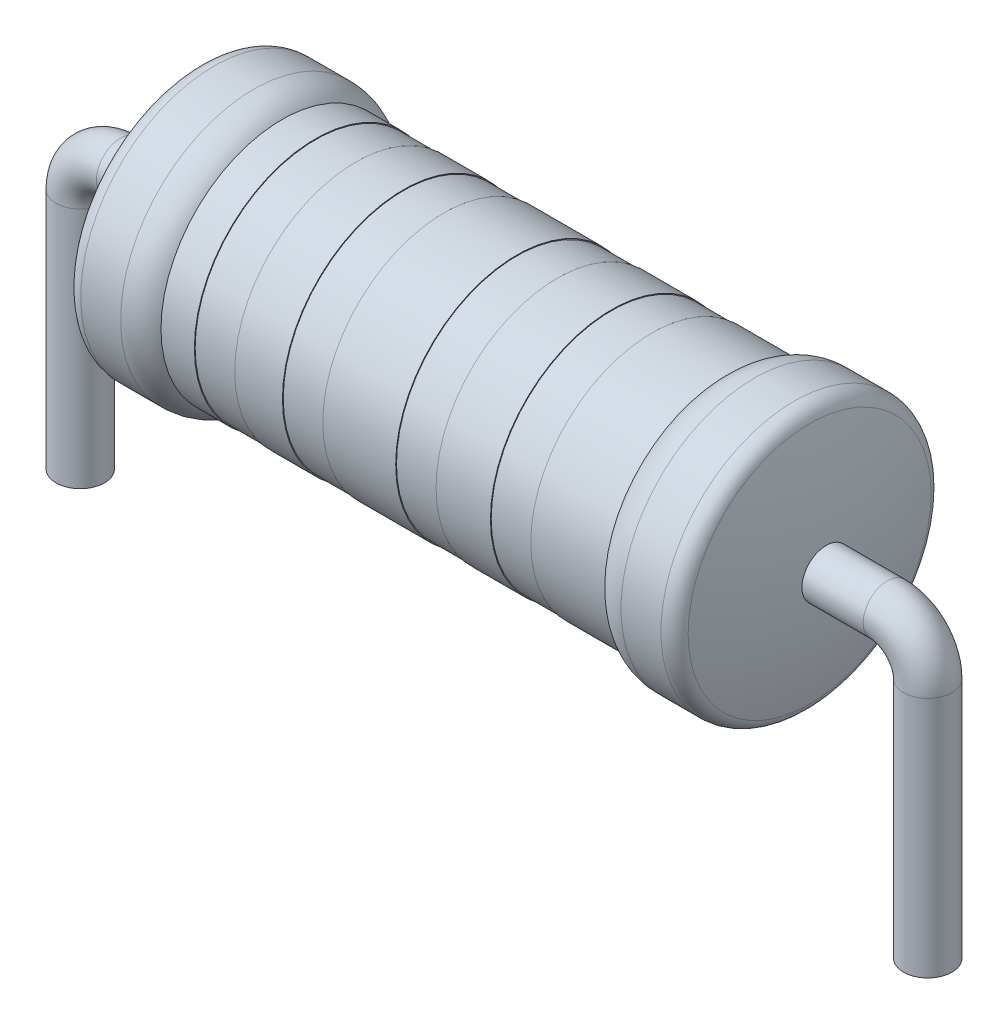
ISO-10303-21;
HEADER;
FILE_DESCRIPTION(('STEP AP214'),'2;1');
FILE_NAME('part.step','',(''),(''),'','','');
FILE_SCHEMA(('AUTOMOTIVE_DESIGN { 1 0 10303 214 1 1 1 1 }'));
ENDSEC;
DATA;
#1=APPLICATION_CONTEXT('core data for automotive mechanical design processes');
#2=APPLICATION_PROTOCOL_DEFINITION('international standard','automotive_design',2000,#1);
#3=PRODUCT_CONTEXT('',#1,'mechanical');
#4=PRODUCT('Part','Part','',(#3));
#5=PRODUCT_RELATED_PRODUCT_CATEGORY('part','',(#4));
#6=PRODUCT_DEFINITION_FORMATION('','',#4);
#7=PRODUCT_DEFINITION_CONTEXT('part definition',#1,'design');
#8=PRODUCT_DEFINITION('design','',#6,#7);
#9=PRODUCT_DEFINITION_SHAPE('','',#8);
#10=(LENGTH_UNIT() NAMED_UNIT(*) SI_UNIT(.MILLI.,.METRE.));
#11=(NAMED_UNIT(*) PLANE_ANGLE_UNIT() SI_UNIT($,.RADIAN.));
#12=(NAMED_UNIT(*) SI_UNIT($,.STERADIAN.) SOLID_ANGLE_UNIT());
#13=UNCERTAINTY_MEASURE_WITH_UNIT(LENGTH_MEASURE(1.E-05),#10,'distance_accuracy_value','');
#14=(GEOMETRIC_REPRESENTATION_CONTEXT(3) GLOBAL_UNCERTAINTY_ASSIGNED_CONTEXT((#13)) GLOBAL_UNIT_ASSIGNED_CONTEXT((#10,
#11,#12)) REPRESENTATION_CONTEXT('',''));
#15=CARTESIAN_POINT('',(0.,0.,0.));
#16=DIRECTION('',(0.,0.,1.));
#17=DIRECTION('',(1.,0.,0.));
#18=AXIS2_PLACEMENT_3D('',#15,#16,#17);
#19=CARTESIAN_POINT('',(20.5,4.999999999705,0.));
#20=DIRECTION('',(1.,0.,0.));
#21=DIRECTION('',(0.,0.,-1.));
#22=AXIS2_PLACEMENT_3D('',#19,#20,#21);
#23=CYLINDRICAL_SURFACE('',#22,3.);
#24=CARTESIAN_POINT('',(11.8159782028815,4.999999999705,0.));
#25=DIRECTION('',(-1.,0.,0.));
#26=DIRECTION('',(0.,0.,1.));
#27=AXIS2_PLACEMENT_3D('',#24,#25,#26);
#28=CIRCLE('',#27,3.);
#29=CARTESIAN_POINT('',(11.8159782028815,4.999999999705,3.));
#30=VERTEX_POINT('',#29);
#31=EDGE_CURVE('E229',#30,#30,#28,.T.);
#32=ORIENTED_EDGE('',*,*,#31,.F.);
#33=EDGE_LOOP('',(#32));
#34=FACE_BOUND('',#33,.T.);
#35=CARTESIAN_POINT('',(13.1631116175557,4.999999999705,0.));
#36=DIRECTION('',(-1.,0.,0.));
#37=DIRECTION('',(0.,0.,1.));
#38=AXIS2_PLACEMENT_3D('',#35,#36,#37);
#39=CIRCLE('',#38,3.);
#40=CARTESIAN_POINT('',(13.1631116175557,4.999999999705,3.));
#41=VERTEX_POINT('',#40);
#42=EDGE_CURVE('E216',#41,#41,#39,.T.);
#43=ORIENTED_EDGE('',*,*,#42,.T.);
#44=EDGE_LOOP('',(#43));
#45=FACE_BOUND('',#44,.T.);
#46=ADVANCED_FACE('F40',(#34,#45),#23,.T.);
#47=CARTESIAN_POINT('',(9.00968218444738,4.999999999705,0.));
#48=DIRECTION('',(-1.,0.,0.));
#49=DIRECTION('',(0.,0.,1.));
#50=AXIS2_PLACEMENT_3D('',#47,#48,#49);
#51=CIRCLE('',#50,3.);
#52=CARTESIAN_POINT('',(9.00968218444738,4.999999999705,3.));
#53=VERTEX_POINT('',#52);
#54=EDGE_CURVE('E241',#53,#53,#51,.T.);
#55=ORIENTED_EDGE('',*,*,#54,.F.);
#56=EDGE_LOOP('',(#55));
#57=FACE_BOUND('',#56,.T.);
#58=CARTESIAN_POINT('',(10.8159782028815,4.999999999705,0.));
#59=DIRECTION('',(-1.,0.,0.));
#60=DIRECTION('',(0.,0.,1.));
#61=AXIS2_PLACEMENT_3D('',#58,#59,#60);
#62=CIRCLE('',#61,3.);
#63=CARTESIAN_POINT('',(10.8159782028815,4.999999999705,3.));
#64=VERTEX_POINT('',#63);
#65=EDGE_CURVE('E226',#64,#64,#62,.T.);
#66=ORIENTED_EDGE('',*,*,#65,.T.);
#67=EDGE_LOOP('',(#66));
#68=FACE_BOUND('',#67,.T.);
#69=ADVANCED_FACE('F197',(#57,#68),#23,.T.);
#70=CARTESIAN_POINT('',(6.82738817019401,4.999999999705,0.));
#71=DIRECTION('',(-1.,0.,0.));
#72=DIRECTION('',(0.,0.,1.));
#73=AXIS2_PLACEMENT_3D('',#70,#71,#72);
#74=CIRCLE('',#73,3.);
#75=CARTESIAN_POINT('',(6.82738817019401,4.999999999705,3.));
#76=VERTEX_POINT('',#75);
#77=EDGE_CURVE('E253',#76,#76,#74,.T.);
#78=ORIENTED_EDGE('',*,*,#77,.F.);
#79=EDGE_LOOP('',(#78));
#80=FACE_BOUND('',#79,.T.);
#81=CARTESIAN_POINT('',(8.00968218444737,4.999999999705,0.));
#82=DIRECTION('',(-1.,0.,0.));
#83=DIRECTION('',(0.,0.,1.));
#84=AXIS2_PLACEMENT_3D('',#81,#82,#83);
#85=CIRCLE('',#84,3.);
#86=CARTESIAN_POINT('',(8.00968218444737,4.999999999705,3.));
#87=VERTEX_POINT('',#86);
#88=EDGE_CURVE('E238',#87,#87,#85,.T.);
#89=ORIENTED_EDGE('',*,*,#88,.T.);
#90=EDGE_LOOP('',(#89));
#91=FACE_BOUND('',#90,.T.);
#92=ADVANCED_FACE('F135',(#80,#91),#23,.T.);
#93=CARTESIAN_POINT('',(5.00000000000037,4.999999999705,0.));
#94=DIRECTION('',(1.,0.,0.));
#95=DIRECTION('',(0.,0.,-1.));
#96=AXIS2_PLACEMENT_3D('',#93,#94,#95);
#97=CIRCLE('',#96,3.00000000000032);
#98=CARTESIAN_POINT('',(5.00000000000037,4.999999999705,-3.00000000000032));
#99=VERTEX_POINT('',#98);
#100=EDGE_CURVE('E89',#99,#99,#97,.F.);
#101=ORIENTED_EDGE('',*,*,#100,.F.);
#102=EDGE_LOOP('',(#101));
#103=FACE_BOUND('',#102,.T.);
#104=CARTESIAN_POINT('',(5.82738817019401,4.999999999705,0.));
#105=DIRECTION('',(-1.,0.,0.));
#106=DIRECTION('',(0.,0.,1.));
#107=AXIS2_PLACEMENT_3D('',#104,#105,#106);
#108=CIRCLE('',#107,3.);
#109=CARTESIAN_POINT('',(5.82738817019401,4.999999999705,3.));
#110=VERTEX_POINT('',#109);
#111=EDGE_CURVE('E250',#110,#110,#108,.T.);
#112=ORIENTED_EDGE('',*,*,#111,.T.);
#113=EDGE_LOOP('',(#112));
#114=FACE_BOUND('',#113,.T.);
#115=ADVANCED_FACE('F130',(#103,#114),#23,.T.);
#116=CARTESIAN_POINT('',(4.338699332717,4.999999999705,0.));
#117=DIRECTION('',(1.,0.,0.));
#118=DIRECTION('',(0.,0.,-1.));
#119=AXIS2_PLACEMENT_3D('',#116,#117,#118);
#120=TOROIDAL_SURFACE('',#119,2.423631776339,0.877222264763);
#121=CARTESIAN_POINT('',(4.3,4.999999999705,0.));
#122=DIRECTION('',(1.,0.,0.));
#123=DIRECTION('',(0.,0.,-1.));
#124=AXIS2_PLACEMENT_3D('',#121,#122,#123);
#125=CIRCLE('',#124,3.3);
#126=CARTESIAN_POINT('',(4.3,4.999999999705,-3.3));
#127=VERTEX_POINT('',#126);
#128=EDGE_CURVE('E88',#127,#127,#125,.F.);
#129=ORIENTED_EDGE('',*,*,#128,.F.);
#130=EDGE_LOOP('',(#129));
#131=FACE_BOUND('',#130,.T.);
#132=ORIENTED_EDGE('',*,*,#100,.T.);
#133=EDGE_LOOP('',(#132));
#134=FACE_BOUND('',#133,.T.);
#135=ADVANCED_FACE('F124',(#131,#134),#120,.T.);
#136=CARTESIAN_POINT('',(1.,3.999999999705,0.));
#137=DIRECTION('',(0.,0.,-1.));
#138=DIRECTION('',(-1.,0.,0.));
#139=AXIS2_PLACEMENT_3D('',#136,#137,#138);
#140=TOROIDAL_SURFACE('',#139,1.,0.6);
#141=CARTESIAN_POINT('',(0.,3.999999999705,0.));
#142=DIRECTION('',(0.,1.,0.));
#143=DIRECTION('',(-1.,0.,0.));
#144=AXIS2_PLACEMENT_3D('',#141,#142,#143);
#145=CIRCLE('',#144,0.6);
#146=CARTESIAN_POINT('',(-0.6,3.999999999705,0.));
#147=VERTEX_POINT('',#146);
#148=EDGE_CURVE('E83',#147,#147,#145,.T.);
#149=ORIENTED_EDGE('',*,*,#148,.T.);
#150=EDGE_LOOP('',(#149));
#151=FACE_BOUND('',#150,.T.);
#152=CARTESIAN_POINT('',(1.,4.999999999705,0.));
#153=DIRECTION('',(1.,0.,0.));
#154=DIRECTION('',(0.,1.,0.));
#155=AXIS2_PLACEMENT_3D('',#152,#153,#154);
#156=CIRCLE('',#155,0.6);
#157=CARTESIAN_POINT('',(1.,5.599999999705,0.));
#158=VERTEX_POINT('',#157);
#159=EDGE_CURVE('E91',#158,#158,#156,.T.);
#160=ORIENTED_EDGE('',*,*,#159,.F.);
#161=EDGE_LOOP('',(#160));
#162=FACE_BOUND('',#161,.T.);
#163=ADVANCED_FACE('F119',(#151,#162),#140,.T.);
#164=CARTESIAN_POINT('',(20.5,4.999999999705,0.));
#165=DIRECTION('',(1.,0.,0.));
#166=DIRECTION('',(0.,0.,-1.));
#167=AXIS2_PLACEMENT_3D('',#164,#165,#166);
#168=CYLINDRICAL_SURFACE('',#167,3.3);
#169=CARTESIAN_POINT('',(3.31099855786117,4.999999999705,0.));
#170=DIRECTION('',(1.,0.,0.));
#171=DIRECTION('',(0.,0.,-1.));
#172=AXIS2_PLACEMENT_3D('',#169,#170,#171);
#173=CIRCLE('',#172,3.3);
#174=CARTESIAN_POINT('',(3.31099855786117,4.999999999705,-3.3));
#175=VERTEX_POINT('',#174);
#176=EDGE_CURVE('E51',#175,#175,#173,.T.);
#177=ORIENTED_EDGE('',*,*,#176,.T.);
#178=EDGE_LOOP('',(#177));
#179=FACE_BOUND('',#178,.T.);
#180=ORIENTED_EDGE('',*,*,#128,.T.);
#181=EDGE_LOOP('',(#180));
#182=FACE_BOUND('',#181,.T.);
#183=ADVANCED_FACE('F123',(#179,#182),#168,.T.);
#184=CARTESIAN_POINT('',(1.,4.999999999705,0.));
#185=DIRECTION('',(1.,0.,0.));
#186=DIRECTION('',(0.,1.,0.));
#187=AXIS2_PLACEMENT_3D('',#184,#185,#186);
#188=CYLINDRICAL_SURFACE('',#187,0.6);
#189=ORIENTED_EDGE('',*,*,#159,.T.);
#190=EDGE_LOOP('',(#189));
#191=FACE_BOUND('',#190,.T.);
#192=CARTESIAN_POINT('',(2.5167996655,4.999999999705,0.));
#193=DIRECTION('',(-1.,0.,0.));
#194=DIRECTION('',(0.,0.,1.));
#195=AXIS2_PLACEMENT_3D('',#192,#193,#194);
#196=CIRCLE('',#195,0.6);
#197=CARTESIAN_POINT('',(2.5167996655,4.999999999705,0.6));
#198=VERTEX_POINT('',#197);
#199=EDGE_CURVE('E60',#198,#198,#196,.T.);
#200=ORIENTED_EDGE('',*,*,#199,.T.);
#201=EDGE_LOOP('',(#200));
#202=FACE_BOUND('',#201,.T.);
#203=ADVANCED_FACE('F126',(#191,#202),#188,.T.);
#204=CARTESIAN_POINT('',(3.0101848198376,4.999999999705,3.3));
#205=CARTESIAN_POINT('',(2.9893157395012,4.999999999705,3.2277501692225));
#206=CARTESIAN_POINT('',(2.9684466591648,4.999999999705,3.155500338445));
#207=CARTESIAN_POINT('',(2.9475775788284,4.999999999705,3.0832505076675));
#208=CARTESIAN_POINT('',(2.926708498492,4.999999999705,3.01100067689));
#209=CARTESIAN_POINT('',(2.756683855238,4.999999999705,2.422366606529));
#210=CARTESIAN_POINT('',(2.630918550792,4.999999999705,1.820943837465));
#211=CARTESIAN_POINT('',(2.550859633277,4.999999999705,1.211750248629));
#212=CARTESIAN_POINT('',(2.5167996655,4.999999999705,0.6));
#213=(BOUNDED_CURVE() B_SPLINE_CURVE(4,(#204,#205,#206,#207,#208,#209,#210,#211,#212),
.UNSPECIFIED.,.F.,.F.) B_SPLINE_CURVE_WITH_KNOTS((5,4,5),(4.40350901780451,4.431196291133,
4.656770139835),
.UNSPECIFIED.) CURVE() GEOMETRIC_REPRESENTATION_ITEM() RATIONAL_B_SPLINE_CURVE((1.,1.,1.,1.,1.,
1.,1.,1.,1.)) REPRESENTATION_ITEM(''));
#214=CARTESIAN_POINT('',(13.364692755058,4.999999999705,0.));
#215=DIRECTION('',(-1.,0.,0.));
#216=AXIS1_PLACEMENT('',#214,#215);
#217=SURFACE_OF_REVOLUTION('',#213,#216);
#218=CARTESIAN_POINT('',(2.92670849849187,4.999999999705,0.));
#219=DIRECTION('',(-1.,0.,0.));
#220=DIRECTION('',(0.,0.,1.));
#221=AXIS2_PLACEMENT_3D('',#218,#219,#220);
#222=CIRCLE('',#221,3.01100067688954);
#223=CARTESIAN_POINT('',(2.92670849849187,4.999999999705,3.01100067688954));
#224=VERTEX_POINT('',#223);
#225=EDGE_CURVE('E55',#224,#224,#222,.T.);
#226=ORIENTED_EDGE('',*,*,#225,.T.);
#227=EDGE_LOOP('',(#226));
#228=FACE_BOUND('',#227,.T.);
#229=ORIENTED_EDGE('',*,*,#199,.F.);
#230=EDGE_LOOP('',(#229));
#231=FACE_BOUND('',#230,.T.);
#232=ADVANCED_FACE('F137',(#228,#231),#217,.T.);
#233=CARTESIAN_POINT('',(0.,-2.,0.));
#234=DIRECTION('',(0.,1.,0.));
#235=DIRECTION('',(-1.,0.,0.));
#236=AXIS2_PLACEMENT_3D('',#233,#234,#235);
#237=CYLINDRICAL_SURFACE('',#236,0.6);
#238=CARTESIAN_POINT('',(0.,-2.,0.));
#239=DIRECTION('',(0.,-1.,0.));
#240=DIRECTION('',(1.,0.,0.));
#241=AXIS2_PLACEMENT_3D('',#238,#239,#240);
#242=CIRCLE('',#241,0.6);
#243=CARTESIAN_POINT('',(0.6,-2.,0.));
#244=VERTEX_POINT('',#243);
#245=EDGE_CURVE('E262',#244,#244,#242,.T.);
#246=ORIENTED_EDGE('',*,*,#245,.F.);
#247=EDGE_LOOP('',(#246));
#248=FACE_BOUND('',#247,.T.);
#249=ORIENTED_EDGE('',*,*,#148,.F.);
#250=EDGE_LOOP('',(#249));
#251=FACE_BOUND('',#250,.T.);
#252=ADVANCED_FACE('F132',(#248,#251),#237,.T.);
#253=CARTESIAN_POINT('',(0.,-2.,0.));
#254=DIRECTION('',(0.,-1.,0.));
#255=DIRECTION('',(1.,0.,0.));
#256=AXIS2_PLACEMENT_3D('',#253,#254,#255);
#257=PLANE('',#256);
#258=ORIENTED_EDGE('',*,*,#245,.T.);
#259=EDGE_LOOP('',(#258));
#260=FACE_BOUND('',#259,.T.);
#261=ADVANCED_FACE('F183',(#260),#257,.T.);
#262=CARTESIAN_POINT('',(3.31099855786117,4.999999999705,0.));
#263=DIRECTION('',(1.,0.,0.));
#264=DIRECTION('',(0.,0.,-1.));
#265=AXIS2_PLACEMENT_3D('',#262,#263,#264);
#266=TOROIDAL_SURFACE('',#265,2.9,0.4);
#267=ORIENTED_EDGE('',*,*,#176,.F.);
#268=EDGE_LOOP('',(#267));
#269=FACE_BOUND('',#268,.T.);
#270=ORIENTED_EDGE('',*,*,#225,.F.);
#271=EDGE_LOOP('',(#270));
#272=FACE_BOUND('',#271,.T.);
#273=ADVANCED_FACE('F180',(#269,#272),#266,.T.);
#274=CARTESIAN_POINT('',(5.82738817019401,7.999999999705,0.));
#275=DIRECTION('',(1.,0.,0.));
#276=DIRECTION('',(0.,0.,-1.));
#277=AXIS2_PLACEMENT_3D('',#274,#275,#276);
#278=PLANE('',#277);
#279=CARTESIAN_POINT('',(5.82738817019401,4.999999999705,0.));
#280=DIRECTION('',(-1.,0.,0.));
#281=DIRECTION('',(0.,0.,1.));
#282=AXIS2_PLACEMENT_3D('',#279,#280,#281);
#283=CIRCLE('',#282,2.98);
#284=CARTESIAN_POINT('',(5.82738817019401,4.999999999705,2.98));
#285=VERTEX_POINT('',#284);
#286=EDGE_CURVE('E259',#285,#285,#283,.T.);
#287=ORIENTED_EDGE('',*,*,#286,.T.);
#288=EDGE_LOOP('',(#287));
#289=FACE_BOUND('',#288,.T.);
#290=ORIENTED_EDGE('',*,*,#111,.F.);
#291=EDGE_LOOP('',(#290));
#292=FACE_BOUND('',#291,.T.);
#293=ADVANCED_FACE('F182',(#289,#292),#278,.T.);
#294=CARTESIAN_POINT('',(2.5167996655,4.999999999705,0.));
#295=DIRECTION('',(-1.,0.,0.));
#296=DIRECTION('',(0.,0.,1.));
#297=AXIS2_PLACEMENT_3D('',#294,#295,#296);
#298=CYLINDRICAL_SURFACE('',#297,2.98);
#299=CARTESIAN_POINT('',(6.82738817019401,4.999999999705,0.));
#300=DIRECTION('',(-1.,0.,0.));
#301=DIRECTION('',(0.,0.,1.));
#302=AXIS2_PLACEMENT_3D('',#299,#300,#301);
#303=CIRCLE('',#302,2.98);
#304=CARTESIAN_POINT('',(6.82738817019401,4.999999999705,2.98));
#305=VERTEX_POINT('',#304);
#306=EDGE_CURVE('E256',#305,#305,#303,.T.);
#307=ORIENTED_EDGE('',*,*,#306,.T.);
#308=EDGE_LOOP('',(#307));
#309=FACE_BOUND('',#308,.T.);
#310=ORIENTED_EDGE('',*,*,#286,.F.);
#311=EDGE_LOOP('',(#310));
#312=FACE_BOUND('',#311,.T.);
#313=ADVANCED_FACE('F189',(#309,#312),#298,.T.);
#314=CARTESIAN_POINT('',(6.82738817019401,7.999999999705,0.));
#315=DIRECTION('',(-1.,0.,0.));
#316=DIRECTION('',(0.,0.,1.));
#317=AXIS2_PLACEMENT_3D('',#314,#315,#316);
#318=PLANE('',#317);
#319=ORIENTED_EDGE('',*,*,#77,.T.);
#320=EDGE_LOOP('',(#319));
#321=FACE_BOUND('',#320,.T.);
#322=ORIENTED_EDGE('',*,*,#306,.F.);
#323=EDGE_LOOP('',(#322));
#324=FACE_BOUND('',#323,.T.);
#325=ADVANCED_FACE('F289',(#321,#324),#318,.T.);
#326=CARTESIAN_POINT('',(8.00968218444737,7.999999999705,0.));
#327=DIRECTION('',(1.,0.,0.));
#328=DIRECTION('',(0.,0.,-1.));
#329=AXIS2_PLACEMENT_3D('',#326,#327,#328);
#330=PLANE('',#329);
#331=CARTESIAN_POINT('',(8.00968218444737,4.999999999705,0.));
#332=DIRECTION('',(-1.,0.,0.));
#333=DIRECTION('',(0.,0.,1.));
#334=AXIS2_PLACEMENT_3D('',#331,#332,#333);
#335=CIRCLE('',#334,2.98);
#336=CARTESIAN_POINT('',(8.00968218444737,4.999999999705,2.98));
#337=VERTEX_POINT('',#336);
#338=EDGE_CURVE('E247',#337,#337,#335,.T.);
#339=ORIENTED_EDGE('',*,*,#338,.T.);
#340=EDGE_LOOP('',(#339));
#341=FACE_BOUND('',#340,.T.);
#342=ORIENTED_EDGE('',*,*,#88,.F.);
#343=EDGE_LOOP('',(#342));
#344=FACE_BOUND('',#343,.T.);
#345=ADVANCED_FACE('F293',(#341,#344),#330,.T.);
#346=CARTESIAN_POINT('',(2.5167996655,4.999999999705,0.));
#347=DIRECTION('',(-1.,0.,0.));
#348=DIRECTION('',(0.,0.,1.));
#349=AXIS2_PLACEMENT_3D('',#346,#347,#348);
#350=CYLINDRICAL_SURFACE('',#349,2.98);
#351=CARTESIAN_POINT('',(9.00968218444738,4.999999999705,0.));
#352=DIRECTION('',(-1.,0.,0.));
#353=DIRECTION('',(0.,0.,1.));
#354=AXIS2_PLACEMENT_3D('',#351,#352,#353);
#355=CIRCLE('',#354,2.98);
#356=CARTESIAN_POINT('',(9.00968218444738,4.999999999705,2.98));
#357=VERTEX_POINT('',#356);
#358=EDGE_CURVE('E244',#357,#357,#355,.T.);
#359=ORIENTED_EDGE('',*,*,#358,.T.);
#360=EDGE_LOOP('',(#359));
#361=FACE_BOUND('',#360,.T.);
#362=ORIENTED_EDGE('',*,*,#338,.F.);
#363=EDGE_LOOP('',(#362));
#364=FACE_BOUND('',#363,.T.);
#365=ADVANCED_FACE('F297',(#361,#364),#350,.T.);
#366=CARTESIAN_POINT('',(9.00968218444738,7.999999999705,0.));
#367=DIRECTION('',(-1.,0.,0.));
#368=DIRECTION('',(0.,0.,1.));
#369=AXIS2_PLACEMENT_3D('',#366,#367,#368);
#370=PLANE('',#369);
#371=ORIENTED_EDGE('',*,*,#54,.T.);
#372=EDGE_LOOP('',(#371));
#373=FACE_BOUND('',#372,.T.);
#374=ORIENTED_EDGE('',*,*,#358,.F.);
#375=EDGE_LOOP('',(#374));
#376=FACE_BOUND('',#375,.T.);
#377=ADVANCED_FACE('F301',(#373,#376),#370,.T.);
#378=CARTESIAN_POINT('',(10.8159782028815,7.999999999705,0.));
#379=DIRECTION('',(1.,0.,0.));
#380=DIRECTION('',(0.,0.,-1.));
#381=AXIS2_PLACEMENT_3D('',#378,#379,#380);
#382=PLANE('',#381);
#383=CARTESIAN_POINT('',(10.8159782028815,4.999999999705,0.));
#384=DIRECTION('',(-1.,0.,0.));
#385=DIRECTION('',(0.,0.,1.));
#386=AXIS2_PLACEMENT_3D('',#383,#384,#385);
#387=CIRCLE('',#386,2.98);
#388=CARTESIAN_POINT('',(10.8159782028815,4.999999999705,2.98));
#389=VERTEX_POINT('',#388);
#390=EDGE_CURVE('E235',#389,#389,#387,.T.);
#391=ORIENTED_EDGE('',*,*,#390,.T.);
#392=EDGE_LOOP('',(#391));
#393=FACE_BOUND('',#392,.T.);
#394=ORIENTED_EDGE('',*,*,#65,.F.);
#395=EDGE_LOOP('',(#394));
#396=FACE_BOUND('',#395,.T.);
#397=ADVANCED_FACE('F305',(#393,#396),#382,.T.);
#398=CARTESIAN_POINT('',(2.5167996655,4.999999999705,0.));
#399=DIRECTION('',(-1.,0.,0.));
#400=DIRECTION('',(0.,0.,1.));
#401=AXIS2_PLACEMENT_3D('',#398,#399,#400);
#402=CYLINDRICAL_SURFACE('',#401,2.98);
#403=CARTESIAN_POINT('',(11.8159782028815,4.999999999705,0.));
#404=DIRECTION('',(-1.,0.,0.));
#405=DIRECTION('',(0.,0.,1.));
#406=AXIS2_PLACEMENT_3D('',#403,#404,#405);
#407=CIRCLE('',#406,2.98);
#408=CARTESIAN_POINT('',(11.8159782028815,4.999999999705,2.98));
#409=VERTEX_POINT('',#408);
#410=EDGE_CURVE('E232',#409,#409,#407,.T.);
#411=ORIENTED_EDGE('',*,*,#410,.T.);
#412=EDGE_LOOP('',(#411));
#413=FACE_BOUND('',#412,.T.);
#414=ORIENTED_EDGE('',*,*,#390,.F.);
#415=EDGE_LOOP('',(#414));
#416=FACE_BOUND('',#415,.T.);
#417=ADVANCED_FACE('F309',(#413,#416),#402,.T.);
#418=CARTESIAN_POINT('',(11.8159782028815,7.999999999705,0.));
#419=DIRECTION('',(-1.,0.,0.));
#420=DIRECTION('',(0.,0.,1.));
#421=AXIS2_PLACEMENT_3D('',#418,#419,#420);
#422=PLANE('',#421);
#423=ORIENTED_EDGE('',*,*,#31,.T.);
#424=EDGE_LOOP('',(#423));
#425=FACE_BOUND('',#424,.T.);
#426=ORIENTED_EDGE('',*,*,#410,.F.);
#427=EDGE_LOOP('',(#426));
#428=FACE_BOUND('',#427,.T.);
#429=ADVANCED_FACE('F313',(#425,#428),#422,.T.);
#430=CARTESIAN_POINT('',(13.1631116175557,7.999999999705,0.));
#431=DIRECTION('',(1.,0.,0.));
#432=DIRECTION('',(0.,0.,-1.));
#433=AXIS2_PLACEMENT_3D('',#430,#431,#432);
#434=PLANE('',#433);
#435=CARTESIAN_POINT('',(13.1631116175557,4.999999999705,0.));
#436=DIRECTION('',(-1.,0.,0.));
#437=DIRECTION('',(0.,0.,1.));
#438=AXIS2_PLACEMENT_3D('',#435,#436,#437);
#439=CIRCLE('',#438,2.98);
#440=CARTESIAN_POINT('',(13.1631116175557,4.999999999705,2.98));
#441=VERTEX_POINT('',#440);
#442=EDGE_CURVE('E219',#441,#441,#439,.T.);
#443=ORIENTED_EDGE('',*,*,#442,.T.);
#444=EDGE_LOOP('',(#443));
#445=FACE_BOUND('',#444,.T.);
#446=ORIENTED_EDGE('',*,*,#42,.F.);
#447=EDGE_LOOP('',(#446));
#448=FACE_BOUND('',#447,.T.);
#449=ADVANCED_FACE('F317',(#445,#448),#434,.T.);
#450=CARTESIAN_POINT('',(2.5167996655,4.999999999705,0.));
#451=DIRECTION('',(-1.,0.,0.));
#452=DIRECTION('',(0.,0.,1.));
#453=AXIS2_PLACEMENT_3D('',#450,#451,#452);
#454=CYLINDRICAL_SURFACE('',#453,2.98);
#455=CARTESIAN_POINT('',(14.1631116175557,4.999999999705,0.));
#456=DIRECTION('',(-1.,0.,0.));
#457=DIRECTION('',(0.,0.,1.));
#458=AXIS2_PLACEMENT_3D('',#455,#456,#457);
#459=CIRCLE('',#458,2.98);
#460=CARTESIAN_POINT('',(14.1631116175557,4.999999999705,2.98));
#461=VERTEX_POINT('',#460);
#462=EDGE_CURVE('E215',#461,#461,#459,.T.);
#463=ORIENTED_EDGE('',*,*,#462,.T.);
#464=EDGE_LOOP('',(#463));
#465=FACE_BOUND('',#464,.T.);
#466=ORIENTED_EDGE('',*,*,#442,.F.);
#467=EDGE_LOOP('',(#466));
#468=FACE_BOUND('',#467,.T.);
#469=ADVANCED_FACE('F321',(#465,#468),#454,.T.);
#470=CARTESIAN_POINT('',(14.1631116175557,7.999999999705,0.));
#471=DIRECTION('',(-1.,0.,0.));
#472=DIRECTION('',(0.,0.,1.));
#473=AXIS2_PLACEMENT_3D('',#470,#471,#472);
#474=PLANE('',#473);
#475=CARTESIAN_POINT('',(14.1631116175557,4.999999999705,0.));
#476=DIRECTION('',(-1.,0.,0.));
#477=DIRECTION('',(0.,0.,1.));
#478=AXIS2_PLACEMENT_3D('',#475,#476,#477);
#479=CIRCLE('',#478,3.);
#480=CARTESIAN_POINT('',(14.1631116175557,4.999999999705,3.));
#481=VERTEX_POINT('',#480);
#482=EDGE_CURVE('E213',#481,#481,#479,.T.);
#483=ORIENTED_EDGE('',*,*,#482,.T.);
#484=EDGE_LOOP('',(#483));
#485=FACE_BOUND('',#484,.T.);
#486=ORIENTED_EDGE('',*,*,#462,.F.);
#487=EDGE_LOOP('',(#486));
#488=FACE_BOUND('',#487,.T.);
#489=ADVANCED_FACE('F281',(#485,#488),#474,.T.);
#490=CARTESIAN_POINT('',(21.,-2.,0.));
#491=DIRECTION('',(0.,-1.,0.));
#492=DIRECTION('',(1.,0.,0.));
#493=AXIS2_PLACEMENT_3D('',#490,#491,#492);
#494=PLANE('',#493);
#495=CARTESIAN_POINT('',(21.,-2.,0.));
#496=DIRECTION('',(0.,-1.,0.));
#497=DIRECTION('',(1.,0.,0.));
#498=AXIS2_PLACEMENT_3D('',#495,#496,#497);
#499=CIRCLE('',#498,0.6);
#500=CARTESIAN_POINT('',(21.6,-2.,0.));
#501=VERTEX_POINT('',#500);
#502=EDGE_CURVE('E264',#501,#501,#499,.T.);
#503=ORIENTED_EDGE('',*,*,#502,.T.);
#504=EDGE_LOOP('',(#503));
#505=FACE_BOUND('',#504,.T.);
#506=ADVANCED_FACE('F276',(#505),#494,.T.);
#507=CARTESIAN_POINT('',(21.,-2.,0.));
#508=DIRECTION('',(0.,1.,0.));
#509=DIRECTION('',(-1.,0.,0.));
#510=AXIS2_PLACEMENT_3D('',#507,#508,#509);
#511=CYLINDRICAL_SURFACE('',#510,0.6);
#512=ORIENTED_EDGE('',*,*,#502,.F.);
#513=EDGE_LOOP('',(#512));
#514=FACE_BOUND('',#513,.T.);
#515=CARTESIAN_POINT('',(21.,3.999999999705,0.));
#516=DIRECTION('',(0.,1.,0.));
#517=DIRECTION('',(1.,0.,0.));
#518=AXIS2_PLACEMENT_3D('',#515,#516,#517);
#519=CIRCLE('',#518,0.6);
#520=CARTESIAN_POINT('',(21.6,3.999999999705,0.));
#521=VERTEX_POINT('',#520);
#522=EDGE_CURVE('E67',#521,#521,#519,.T.);
#523=ORIENTED_EDGE('',*,*,#522,.F.);
#524=EDGE_LOOP('',(#523));
#525=FACE_BOUND('',#524,.T.);
#526=ADVANCED_FACE('F172',(#514,#525),#511,.T.);
#527=CARTESIAN_POINT('',(20.,3.999999999705,0.));
#528=DIRECTION('',(0.,0.,1.));
#529=DIRECTION('',(1.,0.,0.));
#530=AXIS2_PLACEMENT_3D('',#527,#528,#529);
#531=TOROIDAL_SURFACE('',#530,1.,0.6);
#532=ORIENTED_EDGE('',*,*,#522,.T.);
#533=EDGE_LOOP('',(#532));
#534=FACE_BOUND('',#533,.T.);
#535=CARTESIAN_POINT('',(20.,4.999999999705,0.));
#536=DIRECTION('',(-1.,0.,0.));
#537=DIRECTION('',(0.,-1.,0.));
#538=AXIS2_PLACEMENT_3D('',#535,#536,#537);
#539=CIRCLE('',#538,0.6);
#540=CARTESIAN_POINT('',(20.,4.399999999705,0.));
#541=VERTEX_POINT('',#540);
#542=EDGE_CURVE('E61',#541,#541,#539,.T.);
#543=ORIENTED_EDGE('',*,*,#542,.F.);
#544=EDGE_LOOP('',(#543));
#545=FACE_BOUND('',#544,.T.);
#546=ADVANCED_FACE('F168',(#534,#545),#531,.T.);
#547=CARTESIAN_POINT('',(20.,4.999999999705,0.));
#548=DIRECTION('',(-1.,0.,0.));
#549=DIRECTION('',(0.,-1.,0.));
#550=AXIS2_PLACEMENT_3D('',#547,#548,#549);
#551=CYLINDRICAL_SURFACE('',#550,0.6);
#552=CARTESIAN_POINT('',(18.4832003345,4.999999999705,0.));
#553=DIRECTION('',(-1.,0.,0.));
#554=DIRECTION('',(0.,0.,1.));
#555=AXIS2_PLACEMENT_3D('',#552,#553,#554);
#556=CIRCLE('',#555,0.6);
#557=CARTESIAN_POINT('',(18.4832003345,4.999999999705,0.6));
#558=VERTEX_POINT('',#557);
#559=EDGE_CURVE('E66',#558,#558,#556,.F.);
#560=ORIENTED_EDGE('',*,*,#559,.T.);
#561=EDGE_LOOP('',(#560));
#562=FACE_BOUND('',#561,.T.);
#563=ORIENTED_EDGE('',*,*,#542,.T.);
#564=EDGE_LOOP('',(#563));
#565=FACE_BOUND('',#564,.T.);
#566=ADVANCED_FACE('F165',(#562,#565),#551,.T.);
#567=CARTESIAN_POINT('',(18.5166060923432,4.999999999705,0.));
#568=CARTESIAN_POINT('',(18.5082546528824,4.999999999705,0.150000000000001));
#569=CARTESIAN_POINT('',(18.4999032134216,4.999999999705,0.3));
#570=CARTESIAN_POINT('',(18.4915517739608,4.999999999705,0.45));
#571=CARTESIAN_POINT('',(18.4832003345,4.999999999705,0.6));
#572=CARTESIAN_POINT('',(18.449140366723,4.999999999705,1.211750248629));
#573=CARTESIAN_POINT('',(18.369081449208,4.999999999705,1.820943837465));
#574=CARTESIAN_POINT('',(18.243316144762,4.999999999705,2.422366606529));
#575=CARTESIAN_POINT('',(18.073291501508,4.999999999705,3.01100067689));
#576=CARTESIAN_POINT('',(17.818254536627,4.999999999705,3.8939517824315));
#577=CARTESIAN_POINT('',(17.563217571746,4.999999999705,4.776902887973));
#578=CARTESIAN_POINT('',(17.308180606865,4.999999999705,5.6598539935145));
#579=CARTESIAN_POINT('',(17.053143641984,4.999999999705,6.542805099056));
#580=(BOUNDED_CURVE() B_SPLINE_CURVE(4,(#567,#568,#569,#570,#571,#572,#573,#574,#575,#576,#577,
#578,#579),.UNSPECIFIED.,.F.,.F.) B_SPLINE_CURVE_WITH_KNOTS((5,4,4,5),(1.5711048877305,
1.626415167344,1.851989016046,2.190349789099),
.UNSPECIFIED.) CURVE() GEOMETRIC_REPRESENTATION_ITEM() RATIONAL_B_SPLINE_CURVE((1.,1.,1.,1.,1.,
1.,1.,1.,1.,1.,1.,1.,1.)) REPRESENTATION_ITEM(''));
#581=CARTESIAN_POINT('',(7.635307244942,4.999999999705,0.));
#582=DIRECTION('',(-1.,0.,0.));
#583=AXIS1_PLACEMENT('',#581,#582);
#584=SURFACE_OF_REVOLUTION('',#580,#583);
#585=CARTESIAN_POINT('',(18.0732915015081,4.999999999705,0.));
#586=DIRECTION('',(-1.,0.,0.));
#587=DIRECTION('',(0.,0.,1.));
#588=AXIS2_PLACEMENT_3D('',#585,#586,#587);
#589=CIRCLE('',#588,3.01100067688956);
#590=CARTESIAN_POINT('',(18.0732915015081,4.999999999705,3.01100067688956));
#591=VERTEX_POINT('',#590);
#592=EDGE_CURVE('E11',#591,#591,#589,.F.);
#593=ORIENTED_EDGE('',*,*,#592,.T.);
#594=EDGE_LOOP('',(#593));
#595=FACE_BOUND('',#594,.T.);
#596=ORIENTED_EDGE('',*,*,#559,.F.);
#597=EDGE_LOOP('',(#596));
#598=FACE_BOUND('',#597,.T.);
#599=ADVANCED_FACE('F162',(#595,#598),#584,.T.);
#600=CARTESIAN_POINT('',(17.6890014421388,4.999999999705,0.));
#601=DIRECTION('',(1.,0.,0.));
#602=DIRECTION('',(0.,0.,-1.));
#603=AXIS2_PLACEMENT_3D('',#600,#601,#602);
#604=TOROIDAL_SURFACE('',#603,2.9,0.4);
#605=ORIENTED_EDGE('',*,*,#592,.F.);
#606=EDGE_LOOP('',(#605));
#607=FACE_BOUND('',#606,.T.);
#608=CARTESIAN_POINT('',(17.6890014421388,4.999999999705,0.));
#609=DIRECTION('',(1.,0.,0.));
#610=DIRECTION('',(0.,0.,-1.));
#611=AXIS2_PLACEMENT_3D('',#608,#609,#610);
#612=CIRCLE('',#611,3.3);
#613=CARTESIAN_POINT('',(17.6890014421388,4.999999999705,-3.3));
#614=VERTEX_POINT('',#613);
#615=EDGE_CURVE('E47',#614,#614,#612,.F.);
#616=ORIENTED_EDGE('',*,*,#615,.F.);
#617=EDGE_LOOP('',(#616));
#618=FACE_BOUND('',#617,.T.);
#619=ADVANCED_FACE('F42',(#607,#618),#604,.T.);
#620=CARTESIAN_POINT('',(20.5,4.999999999705,0.));
#621=DIRECTION('',(1.,0.,0.));
#622=DIRECTION('',(0.,0.,-1.));
#623=AXIS2_PLACEMENT_3D('',#620,#621,#622);
#624=CYLINDRICAL_SURFACE('',#623,3.3);
#625=ORIENTED_EDGE('',*,*,#615,.T.);
#626=EDGE_LOOP('',(#625));
#627=FACE_BOUND('',#626,.T.);
#628=CARTESIAN_POINT('',(16.7,4.999999999705,0.));
#629=DIRECTION('',(1.,0.,0.));
#630=DIRECTION('',(0.,0.,-1.));
#631=AXIS2_PLACEMENT_3D('',#628,#629,#630);
#632=CIRCLE('',#631,3.30000000000026);
#633=CARTESIAN_POINT('',(16.7,4.999999999705,-3.30000000000026));
#634=VERTEX_POINT('',#633);
#635=EDGE_CURVE('E151',#634,#634,#632,.F.);
#636=ORIENTED_EDGE('',*,*,#635,.F.);
#637=EDGE_LOOP('',(#636));
#638=FACE_BOUND('',#637,.T.);
#639=ADVANCED_FACE('F142',(#627,#638),#624,.T.);
#640=CARTESIAN_POINT('',(16.661300667283,4.999999999705,0.));
#641=DIRECTION('',(1.,0.,0.));
#642=DIRECTION('',(0.,0.,-1.));
#643=AXIS2_PLACEMENT_3D('',#640,#641,#642);
#644=TOROIDAL_SURFACE('',#643,2.423631776339,0.877222264763);
#645=CARTESIAN_POINT('',(16.,4.999999999705,0.));
#646=DIRECTION('',(1.,0.,0.));
#647=DIRECTION('',(0.,0.,-1.));
#648=AXIS2_PLACEMENT_3D('',#645,#646,#647);
#649=CIRCLE('',#648,3.);
#650=CARTESIAN_POINT('',(16.,4.999999999705,-3.));
#651=VERTEX_POINT('',#650);
#652=EDGE_CURVE('E147',#651,#651,#649,.F.);
#653=ORIENTED_EDGE('',*,*,#652,.F.);
#654=EDGE_LOOP('',(#653));
#655=FACE_BOUND('',#654,.T.);
#656=ORIENTED_EDGE('',*,*,#635,.T.);
#657=EDGE_LOOP('',(#656));
#658=FACE_BOUND('',#657,.T.);
#659=ADVANCED_FACE('F138',(#655,#658),#644,.T.);
#660=ORIENTED_EDGE('',*,*,#652,.T.);
#661=EDGE_LOOP('',(#660));
#662=FACE_BOUND('',#661,.T.);
#663=ORIENTED_EDGE('',*,*,#482,.F.);
#664=EDGE_LOOP('',(#663));
#665=FACE_BOUND('',#664,.T.);
#666=ADVANCED_FACE('F141',(#662,#665),#23,.T.);
#667=CLOSED_SHELL('',(#46,#69,#92,#115,#135,#163,#183,#203,#232,#252,#261,#273,#293,#313,#325,
#345,#365,#377,#397,#417,#429,#449,#469,#489,#506,#526,#546,#566,#599,#619,#639,#659,#666));
#668=MANIFOLD_SOLID_BREP('B2',#667);
#669=ADVANCED_BREP_SHAPE_REPRESENTATION('',(#18,#668),#14);
#670=SHAPE_DEFINITION_REPRESENTATION(#9,#669);
ENDSEC;
END-ISO-10303-21;
